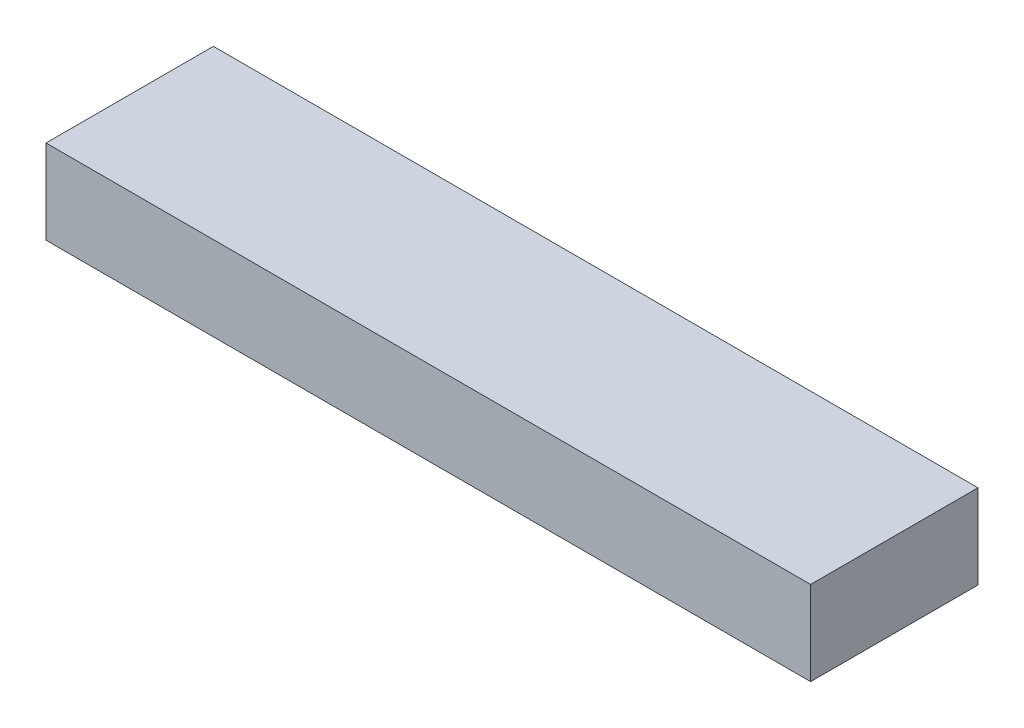
ISO-10303-21;
HEADER;
FILE_DESCRIPTION(('STEP AP214'),'2;1');
FILE_NAME('part.step','',(''),(''),'','','');
FILE_SCHEMA(('AUTOMOTIVE_DESIGN { 1 0 10303 214 1 1 1 1 }'));
ENDSEC;
DATA;
#1=APPLICATION_CONTEXT('core data for automotive mechanical design processes');
#2=APPLICATION_PROTOCOL_DEFINITION('international standard','automotive_design',2000,#1);
#3=PRODUCT_CONTEXT('',#1,'mechanical');
#4=PRODUCT('Part','Part','',(#3));
#5=PRODUCT_RELATED_PRODUCT_CATEGORY('part','',(#4));
#6=PRODUCT_DEFINITION_FORMATION('','',#4);
#7=PRODUCT_DEFINITION_CONTEXT('part definition',#1,'design');
#8=PRODUCT_DEFINITION('design','',#6,#7);
#9=PRODUCT_DEFINITION_SHAPE('','',#8);
#10=(LENGTH_UNIT() NAMED_UNIT(*) SI_UNIT(.MILLI.,.METRE.));
#11=(NAMED_UNIT(*) PLANE_ANGLE_UNIT() SI_UNIT($,.RADIAN.));
#12=(NAMED_UNIT(*) SI_UNIT($,.STERADIAN.) SOLID_ANGLE_UNIT());
#13=UNCERTAINTY_MEASURE_WITH_UNIT(LENGTH_MEASURE(1.E-05),#10,'distance_accuracy_value','');
#14=(GEOMETRIC_REPRESENTATION_CONTEXT(3) GLOBAL_UNCERTAINTY_ASSIGNED_CONTEXT((#13)) GLOBAL_UNIT_ASSIGNED_CONTEXT((#10,
#11,#12)) REPRESENTATION_CONTEXT('',''));
#15=CARTESIAN_POINT('',(0.,0.,0.));
#16=DIRECTION('',(0.,0.,1.));
#17=DIRECTION('',(1.,0.,0.));
#18=AXIS2_PLACEMENT_3D('',#15,#16,#17);
#19=CARTESIAN_POINT('',(10.16,0.,4.95));
#20=DIRECTION('',(0.,0.,-1.));
#21=DIRECTION('',(0.,-1.,0.));
#22=AXIS2_PLACEMENT_3D('',#19,#20,#21);
#23=PLANE('',#22);
#24=DIRECTION('',(0.,1.,0.));
#25=VECTOR('',#24,1.);
#26=CARTESIAN_POINT('',(-1.145,-1.245,4.95));
#27=LINE('',#26,#25);
#28=CARTESIAN_POINT('',(-1.145,-1.245,4.95));
#29=VERTEX_POINT('',#28);
#30=CARTESIAN_POINT('',(-1.145,1.245,4.95));
#31=VERTEX_POINT('',#30);
#32=EDGE_CURVE('E20',#29,#31,#27,.T.);
#33=ORIENTED_EDGE('',*,*,#32,.F.);
#34=DIRECTION('',(-1.,0.,0.));
#35=VECTOR('',#34,1.);
#36=CARTESIAN_POINT('',(21.465,-1.245,4.95));
#37=LINE('',#36,#35);
#38=CARTESIAN_POINT('',(21.465,-1.245,4.95));
#39=VERTEX_POINT('',#38);
#40=EDGE_CURVE('E78',#39,#29,#37,.T.);
#41=ORIENTED_EDGE('',*,*,#40,.F.);
#42=DIRECTION('',(0.,-1.,0.));
#43=VECTOR('',#42,1.);
#44=CARTESIAN_POINT('',(21.465,1.245,4.95));
#45=LINE('',#44,#43);
#46=CARTESIAN_POINT('',(21.465,1.245,4.95));
#47=VERTEX_POINT('',#46);
#48=EDGE_CURVE('E73',#47,#39,#45,.T.);
#49=ORIENTED_EDGE('',*,*,#48,.F.);
#50=DIRECTION('',(1.,0.,0.));
#51=VECTOR('',#50,1.);
#52=CARTESIAN_POINT('',(-1.145,1.245,4.95));
#53=LINE('',#52,#51);
#54=EDGE_CURVE('E75',#31,#47,#53,.T.);
#55=ORIENTED_EDGE('',*,*,#54,.F.);
#56=EDGE_LOOP('',(#33,#41,#49,#55));
#57=FACE_BOUND('',#56,.T.);
#58=ADVANCED_FACE('F16',(#57),#23,.F.);
#59=CARTESIAN_POINT('',(10.16,0.,0.));
#60=DIRECTION('',(0.,0.,-1.));
#61=DIRECTION('',(0.,-1.,0.));
#62=AXIS2_PLACEMENT_3D('',#59,#60,#61);
#63=PLANE('',#62);
#64=DIRECTION('',(1.,0.,0.));
#65=VECTOR('',#64,1.);
#66=CARTESIAN_POINT('',(-1.145,1.245,0.));
#67=LINE('',#66,#65);
#68=CARTESIAN_POINT('',(-1.145,1.245,0.));
#69=VERTEX_POINT('',#68);
#70=CARTESIAN_POINT('',(21.465,1.245,0.));
#71=VERTEX_POINT('',#70);
#72=EDGE_CURVE('E82',#69,#71,#67,.T.);
#73=ORIENTED_EDGE('',*,*,#72,.T.);
#74=DIRECTION('',(0.,-1.,0.));
#75=VECTOR('',#74,1.);
#76=CARTESIAN_POINT('',(21.465,1.245,0.));
#77=LINE('',#76,#75);
#78=CARTESIAN_POINT('',(21.465,-1.245,0.));
#79=VERTEX_POINT('',#78);
#80=EDGE_CURVE('E65',#71,#79,#77,.T.);
#81=ORIENTED_EDGE('',*,*,#80,.T.);
#82=DIRECTION('',(-1.,0.,0.));
#83=VECTOR('',#82,1.);
#84=CARTESIAN_POINT('',(21.465,-1.245,0.));
#85=LINE('',#84,#83);
#86=CARTESIAN_POINT('',(-1.145,-1.245,0.));
#87=VERTEX_POINT('',#86);
#88=EDGE_CURVE('E114',#79,#87,#85,.T.);
#89=ORIENTED_EDGE('',*,*,#88,.T.);
#90=DIRECTION('',(0.,1.,0.));
#91=VECTOR('',#90,1.);
#92=CARTESIAN_POINT('',(-1.145,-1.245,0.));
#93=LINE('',#92,#91);
#94=EDGE_CURVE('E11',#87,#69,#93,.T.);
#95=ORIENTED_EDGE('',*,*,#94,.T.);
#96=EDGE_LOOP('',(#73,#81,#89,#95));
#97=FACE_BOUND('',#96,.T.);
#98=ADVANCED_FACE('F133',(#97),#63,.T.);
#99=CARTESIAN_POINT('',(-1.145,-1.245,0.));
#100=DIRECTION('',(-1.,0.,0.));
#101=DIRECTION('',(0.,0.,1.));
#102=AXIS2_PLACEMENT_3D('',#99,#100,#101);
#103=PLANE('',#102);
#104=DIRECTION('',(0.,0.,1.));
#105=VECTOR('',#104,1.);
#106=CARTESIAN_POINT('',(-1.145,-1.245,0.));
#107=LINE('',#106,#105);
#108=EDGE_CURVE('E101',#87,#29,#107,.T.);
#109=ORIENTED_EDGE('',*,*,#108,.T.);
#110=ORIENTED_EDGE('',*,*,#32,.T.);
#111=DIRECTION('',(0.,0.,1.));
#112=VECTOR('',#111,1.);
#113=CARTESIAN_POINT('',(-1.145,1.245,0.));
#114=LINE('',#113,#112);
#115=EDGE_CURVE('E91',#69,#31,#114,.T.);
#116=ORIENTED_EDGE('',*,*,#115,.F.);
#117=ORIENTED_EDGE('',*,*,#94,.F.);
#118=EDGE_LOOP('',(#109,#110,#116,#117));
#119=FACE_BOUND('',#118,.T.);
#120=ADVANCED_FACE('F125',(#119),#103,.T.);
#121=CARTESIAN_POINT('',(21.465,-1.245,0.));
#122=DIRECTION('',(0.,-1.,0.));
#123=DIRECTION('',(0.,0.,-1.));
#124=AXIS2_PLACEMENT_3D('',#121,#122,#123);
#125=PLANE('',#124);
#126=DIRECTION('',(0.,0.,1.));
#127=VECTOR('',#126,1.);
#128=CARTESIAN_POINT('',(21.465,-1.245,0.));
#129=LINE('',#128,#127);
#130=EDGE_CURVE('E81',#79,#39,#129,.T.);
#131=ORIENTED_EDGE('',*,*,#130,.T.);
#132=ORIENTED_EDGE('',*,*,#40,.T.);
#133=ORIENTED_EDGE('',*,*,#108,.F.);
#134=ORIENTED_EDGE('',*,*,#88,.F.);
#135=EDGE_LOOP('',(#131,#132,#133,#134));
#136=FACE_BOUND('',#135,.T.);
#137=ADVANCED_FACE('F18',(#136),#125,.T.);
#138=CARTESIAN_POINT('',(21.465,1.245,0.));
#139=DIRECTION('',(1.,0.,0.));
#140=DIRECTION('',(0.,1.,0.));
#141=AXIS2_PLACEMENT_3D('',#138,#139,#140);
#142=PLANE('',#141);
#143=DIRECTION('',(0.,0.,1.));
#144=VECTOR('',#143,1.);
#145=CARTESIAN_POINT('',(21.465,1.245,0.));
#146=LINE('',#145,#144);
#147=EDGE_CURVE('E84',#71,#47,#146,.T.);
#148=ORIENTED_EDGE('',*,*,#147,.T.);
#149=ORIENTED_EDGE('',*,*,#48,.T.);
#150=ORIENTED_EDGE('',*,*,#130,.F.);
#151=ORIENTED_EDGE('',*,*,#80,.F.);
#152=EDGE_LOOP('',(#148,#149,#150,#151));
#153=FACE_BOUND('',#152,.T.);
#154=ADVANCED_FACE('F85',(#153),#142,.T.);
#155=CARTESIAN_POINT('',(-1.145,1.245,0.));
#156=DIRECTION('',(0.,1.,0.));
#157=DIRECTION('',(1.,0.,0.));
#158=AXIS2_PLACEMENT_3D('',#155,#156,#157);
#159=PLANE('',#158);
#160=ORIENTED_EDGE('',*,*,#115,.T.);
#161=ORIENTED_EDGE('',*,*,#54,.T.);
#162=ORIENTED_EDGE('',*,*,#147,.F.);
#163=ORIENTED_EDGE('',*,*,#72,.F.);
#164=EDGE_LOOP('',(#160,#161,#162,#163));
#165=FACE_BOUND('',#164,.T.);
#166=ADVANCED_FACE('F90',(#165),#159,.T.);
#167=CLOSED_SHELL('',(#58,#98,#120,#137,#154,#166));
#168=MANIFOLD_SOLID_BREP('B1',#167);
#169=ADVANCED_BREP_SHAPE_REPRESENTATION('',(#18,#168),#14);
#170=SHAPE_DEFINITION_REPRESENTATION(#9,#169);
ENDSEC;
END-ISO-10303-21;
